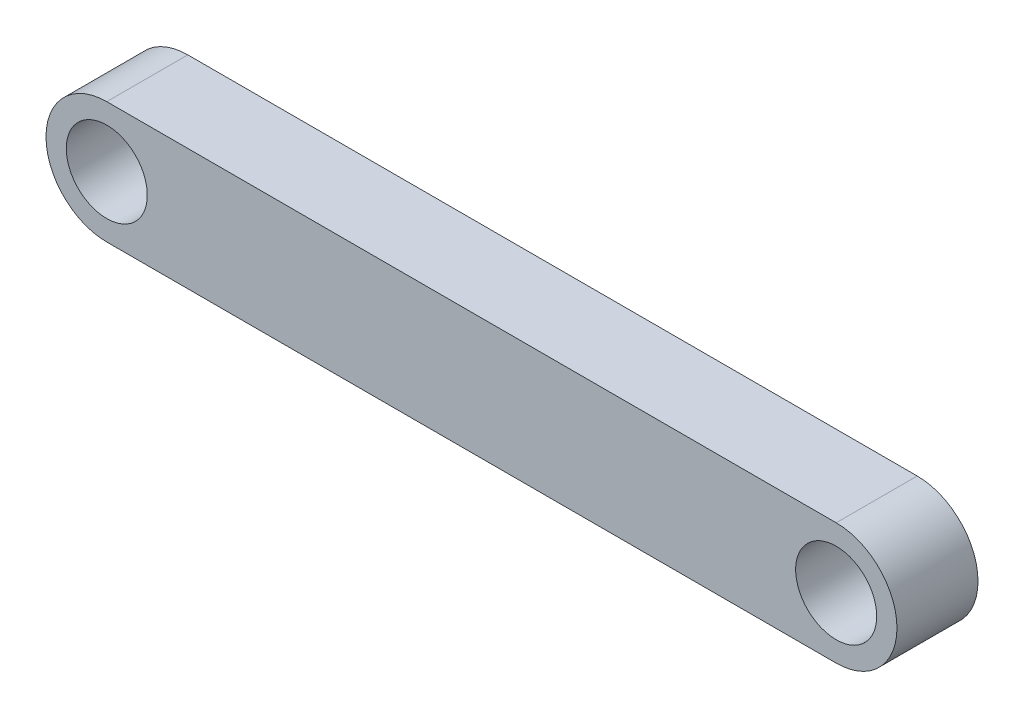
ISO-10303-21;
HEADER;
FILE_DESCRIPTION(('STEP AP214'),'2;1');
FILE_NAME('part.step','',(''),(''),'','','');
FILE_SCHEMA(('AUTOMOTIVE_DESIGN { 1 0 10303 214 1 1 1 1 }'));
ENDSEC;
DATA;
#1=APPLICATION_CONTEXT('core data for automotive mechanical design processes');
#2=APPLICATION_PROTOCOL_DEFINITION('international standard','automotive_design',2000,#1);
#3=PRODUCT_CONTEXT('',#1,'mechanical');
#4=PRODUCT('Part','Part','',(#3));
#5=PRODUCT_RELATED_PRODUCT_CATEGORY('part','',(#4));
#6=PRODUCT_DEFINITION_FORMATION('','',#4);
#7=PRODUCT_DEFINITION_CONTEXT('part definition',#1,'design');
#8=PRODUCT_DEFINITION('design','',#6,#7);
#9=PRODUCT_DEFINITION_SHAPE('','',#8);
#10=(LENGTH_UNIT() NAMED_UNIT(*) SI_UNIT(.MILLI.,.METRE.));
#11=(NAMED_UNIT(*) PLANE_ANGLE_UNIT() SI_UNIT($,.RADIAN.));
#12=(NAMED_UNIT(*) SI_UNIT($,.STERADIAN.) SOLID_ANGLE_UNIT());
#13=UNCERTAINTY_MEASURE_WITH_UNIT(LENGTH_MEASURE(1.E-05),#10,'distance_accuracy_value','');
#14=(GEOMETRIC_REPRESENTATION_CONTEXT(3) GLOBAL_UNCERTAINTY_ASSIGNED_CONTEXT((#13)) GLOBAL_UNIT_ASSIGNED_CONTEXT((#10,
#11,#12)) REPRESENTATION_CONTEXT('',''));
#15=CARTESIAN_POINT('',(0.,0.,0.));
#16=DIRECTION('',(0.,0.,1.));
#17=DIRECTION('',(1.,0.,0.));
#18=AXIS2_PLACEMENT_3D('',#15,#16,#17);
#19=CARTESIAN_POINT('',(0.,0.,4.));
#20=DIRECTION('',(0.,0.,1.));
#21=DIRECTION('',(1.,0.,0.));
#22=AXIS2_PLACEMENT_3D('',#19,#20,#21);
#23=PLANE('',#22);
#24=CARTESIAN_POINT('',(0.,0.,4.));
#25=DIRECTION('',(0.,0.,1.));
#26=DIRECTION('',(1.,0.,0.));
#27=AXIS2_PLACEMENT_3D('',#24,#25,#26);
#28=CIRCLE('',#27,2.);
#29=CARTESIAN_POINT('',(2.,0.,4.));
#30=VERTEX_POINT('',#29);
#31=EDGE_CURVE('E106',#30,#30,#28,.T.);
#32=ORIENTED_EDGE('',*,*,#31,.F.);
#33=EDGE_LOOP('',(#32));
#34=FACE_BOUND('',#33,.T.);
#35=CARTESIAN_POINT('',(0.,0.,4.));
#36=DIRECTION('',(0.,0.,1.));
#37=DIRECTION('',(1.,0.,0.));
#38=AXIS2_PLACEMENT_3D('',#35,#36,#37);
#39=CIRCLE('',#38,3.);
#40=CARTESIAN_POINT('',(0.,-3.,4.));
#41=VERTEX_POINT('',#40);
#42=CARTESIAN_POINT('',(0.,3.,4.));
#43=VERTEX_POINT('',#42);
#44=EDGE_CURVE('E91',#41,#43,#39,.T.);
#45=ORIENTED_EDGE('',*,*,#44,.T.);
#46=DIRECTION('',(-1.,0.,0.));
#47=VECTOR('',#46,1.);
#48=CARTESIAN_POINT('',(-36.,3.,4.));
#49=LINE('',#48,#47);
#50=CARTESIAN_POINT('',(-36.,3.,4.));
#51=VERTEX_POINT('',#50);
#52=EDGE_CURVE('E86',#43,#51,#49,.T.);
#53=ORIENTED_EDGE('',*,*,#52,.T.);
#54=CARTESIAN_POINT('',(-36.,0.,4.));
#55=DIRECTION('',(0.,0.,1.));
#56=DIRECTION('',(-1.,0.,0.));
#57=AXIS2_PLACEMENT_3D('',#54,#55,#56);
#58=CIRCLE('',#57,3.);
#59=CARTESIAN_POINT('',(-36.,-3.,4.));
#60=VERTEX_POINT('',#59);
#61=EDGE_CURVE('E87',#51,#60,#58,.T.);
#62=ORIENTED_EDGE('',*,*,#61,.T.);
#63=DIRECTION('',(1.,0.,0.));
#64=VECTOR('',#63,1.);
#65=CARTESIAN_POINT('',(-36.,-3.,4.));
#66=LINE('',#65,#64);
#67=EDGE_CURVE('E57',#60,#41,#66,.T.);
#68=ORIENTED_EDGE('',*,*,#67,.T.);
#69=EDGE_LOOP('',(#45,#53,#62,#68));
#70=FACE_BOUND('',#69,.T.);
#71=CARTESIAN_POINT('',(-36.,0.,4.));
#72=DIRECTION('',(0.,0.,1.));
#73=DIRECTION('',(-1.,0.,0.));
#74=AXIS2_PLACEMENT_3D('',#71,#72,#73);
#75=CIRCLE('',#74,2.);
#76=CARTESIAN_POINT('',(-38.,0.,4.));
#77=VERTEX_POINT('',#76);
#78=EDGE_CURVE('E123',#77,#77,#75,.T.);
#79=ORIENTED_EDGE('',*,*,#78,.F.);
#80=EDGE_LOOP('',(#79));
#81=FACE_BOUND('',#80,.T.);
#82=ADVANCED_FACE('F39',(#34,#70,#81),#23,.T.);
#83=CARTESIAN_POINT('',(0.,0.,0.));
#84=DIRECTION('',(0.,0.,1.));
#85=DIRECTION('',(1.,0.,0.));
#86=AXIS2_PLACEMENT_3D('',#83,#84,#85);
#87=PLANE('',#86);
#88=CARTESIAN_POINT('',(0.,0.,0.));
#89=DIRECTION('',(0.,0.,1.));
#90=DIRECTION('',(1.,0.,0.));
#91=AXIS2_PLACEMENT_3D('',#88,#89,#90);
#92=CIRCLE('',#91,3.);
#93=CARTESIAN_POINT('',(0.,-3.,0.));
#94=VERTEX_POINT('',#93);
#95=CARTESIAN_POINT('',(0.,3.,0.));
#96=VERTEX_POINT('',#95);
#97=EDGE_CURVE('E104',#94,#96,#92,.T.);
#98=ORIENTED_EDGE('',*,*,#97,.F.);
#99=DIRECTION('',(1.,0.,0.));
#100=VECTOR('',#99,1.);
#101=CARTESIAN_POINT('',(-36.,-3.,0.));
#102=LINE('',#101,#100);
#103=CARTESIAN_POINT('',(-36.,-3.,0.));
#104=VERTEX_POINT('',#103);
#105=EDGE_CURVE('E80',#104,#94,#102,.T.);
#106=ORIENTED_EDGE('',*,*,#105,.F.);
#107=CARTESIAN_POINT('',(-36.,0.,0.));
#108=DIRECTION('',(0.,0.,1.));
#109=DIRECTION('',(-1.,0.,0.));
#110=AXIS2_PLACEMENT_3D('',#107,#108,#109);
#111=CIRCLE('',#110,3.);
#112=CARTESIAN_POINT('',(-36.,3.,0.));
#113=VERTEX_POINT('',#112);
#114=EDGE_CURVE('E74',#113,#104,#111,.T.);
#115=ORIENTED_EDGE('',*,*,#114,.F.);
#116=DIRECTION('',(-1.,0.,0.));
#117=VECTOR('',#116,1.);
#118=CARTESIAN_POINT('',(-36.,3.,0.));
#119=LINE('',#118,#117);
#120=EDGE_CURVE('E94',#96,#113,#119,.T.);
#121=ORIENTED_EDGE('',*,*,#120,.F.);
#122=EDGE_LOOP('',(#98,#106,#115,#121));
#123=FACE_BOUND('',#122,.T.);
#124=CARTESIAN_POINT('',(0.,0.,0.));
#125=DIRECTION('',(0.,0.,1.));
#126=DIRECTION('',(1.,0.,0.));
#127=AXIS2_PLACEMENT_3D('',#124,#125,#126);
#128=CIRCLE('',#127,2.);
#129=CARTESIAN_POINT('',(2.,0.,0.));
#130=VERTEX_POINT('',#129);
#131=EDGE_CURVE('E119',#130,#130,#128,.T.);
#132=ORIENTED_EDGE('',*,*,#131,.T.);
#133=EDGE_LOOP('',(#132));
#134=FACE_BOUND('',#133,.T.);
#135=CARTESIAN_POINT('',(-36.,0.,0.));
#136=DIRECTION('',(0.,0.,1.));
#137=DIRECTION('',(-1.,0.,0.));
#138=AXIS2_PLACEMENT_3D('',#135,#136,#137);
#139=CIRCLE('',#138,2.);
#140=CARTESIAN_POINT('',(-38.,0.,0.));
#141=VERTEX_POINT('',#140);
#142=EDGE_CURVE('E125',#141,#141,#139,.T.);
#143=ORIENTED_EDGE('',*,*,#142,.T.);
#144=EDGE_LOOP('',(#143));
#145=FACE_BOUND('',#144,.T.);
#146=ADVANCED_FACE('F114',(#123,#134,#145),#87,.F.);
#147=CARTESIAN_POINT('',(0.,0.,4.));
#148=DIRECTION('',(0.,0.,-1.));
#149=DIRECTION('',(-1.,0.,0.));
#150=AXIS2_PLACEMENT_3D('',#147,#148,#149);
#151=CYLINDRICAL_SURFACE('',#150,3.);
#152=ORIENTED_EDGE('',*,*,#97,.T.);
#153=DIRECTION('',(0.,0.,-1.));
#154=VECTOR('',#153,1.);
#155=CARTESIAN_POINT('',(0.,3.,4.));
#156=LINE('',#155,#154);
#157=EDGE_CURVE('E11',#43,#96,#156,.T.);
#158=ORIENTED_EDGE('',*,*,#157,.F.);
#159=ORIENTED_EDGE('',*,*,#44,.F.);
#160=DIRECTION('',(0.,0.,-1.));
#161=VECTOR('',#160,1.);
#162=CARTESIAN_POINT('',(0.,-3.,4.));
#163=LINE('',#162,#161);
#164=EDGE_CURVE('E98',#41,#94,#163,.T.);
#165=ORIENTED_EDGE('',*,*,#164,.T.);
#166=EDGE_LOOP('',(#152,#158,#159,#165));
#167=FACE_BOUND('',#166,.T.);
#168=ADVANCED_FACE('F41',(#167),#151,.T.);
#169=CARTESIAN_POINT('',(-36.,3.,4.));
#170=DIRECTION('',(0.,-1.,0.));
#171=DIRECTION('',(0.,0.,-1.));
#172=AXIS2_PLACEMENT_3D('',#169,#170,#171);
#173=PLANE('',#172);
#174=ORIENTED_EDGE('',*,*,#120,.T.);
#175=DIRECTION('',(0.,0.,-1.));
#176=VECTOR('',#175,1.);
#177=CARTESIAN_POINT('',(-36.,3.,4.));
#178=LINE('',#177,#176);
#179=EDGE_CURVE('E48',#51,#113,#178,.T.);
#180=ORIENTED_EDGE('',*,*,#179,.F.);
#181=ORIENTED_EDGE('',*,*,#52,.F.);
#182=ORIENTED_EDGE('',*,*,#157,.T.);
#183=EDGE_LOOP('',(#174,#180,#181,#182));
#184=FACE_BOUND('',#183,.T.);
#185=ADVANCED_FACE('F92',(#184),#173,.F.);
#186=CARTESIAN_POINT('',(-36.,0.,4.));
#187=DIRECTION('',(0.,0.,-1.));
#188=DIRECTION('',(-1.,0.,0.));
#189=AXIS2_PLACEMENT_3D('',#186,#187,#188);
#190=CYLINDRICAL_SURFACE('',#189,3.);
#191=ORIENTED_EDGE('',*,*,#114,.T.);
#192=DIRECTION('',(0.,0.,-1.));
#193=VECTOR('',#192,1.);
#194=CARTESIAN_POINT('',(-36.,-3.,4.));
#195=LINE('',#194,#193);
#196=EDGE_CURVE('E96',#60,#104,#195,.T.);
#197=ORIENTED_EDGE('',*,*,#196,.F.);
#198=ORIENTED_EDGE('',*,*,#61,.F.);
#199=ORIENTED_EDGE('',*,*,#179,.T.);
#200=EDGE_LOOP('',(#191,#197,#198,#199));
#201=FACE_BOUND('',#200,.T.);
#202=ADVANCED_FACE('F100',(#201),#190,.T.);
#203=CARTESIAN_POINT('',(-36.,-3.,4.));
#204=DIRECTION('',(0.,1.,0.));
#205=DIRECTION('',(0.,0.,1.));
#206=AXIS2_PLACEMENT_3D('',#203,#204,#205);
#207=PLANE('',#206);
#208=ORIENTED_EDGE('',*,*,#105,.T.);
#209=ORIENTED_EDGE('',*,*,#164,.F.);
#210=ORIENTED_EDGE('',*,*,#67,.F.);
#211=ORIENTED_EDGE('',*,*,#196,.T.);
#212=EDGE_LOOP('',(#208,#209,#210,#211));
#213=FACE_BOUND('',#212,.T.);
#214=ADVANCED_FACE('F112',(#213),#207,.F.);
#215=CARTESIAN_POINT('',(0.,0.,4.));
#216=DIRECTION('',(0.,0.,-1.));
#217=DIRECTION('',(-1.,0.,0.));
#218=AXIS2_PLACEMENT_3D('',#215,#216,#217);
#219=CYLINDRICAL_SURFACE('',#218,2.);
#220=ORIENTED_EDGE('',*,*,#31,.T.);
#221=EDGE_LOOP('',(#220));
#222=FACE_BOUND('',#221,.T.);
#223=ORIENTED_EDGE('',*,*,#131,.F.);
#224=EDGE_LOOP('',(#223));
#225=FACE_BOUND('',#224,.T.);
#226=ADVANCED_FACE('F141',(#222,#225),#219,.F.);
#227=CARTESIAN_POINT('',(-36.,0.,4.));
#228=DIRECTION('',(0.,0.,-1.));
#229=DIRECTION('',(-1.,0.,0.));
#230=AXIS2_PLACEMENT_3D('',#227,#228,#229);
#231=CYLINDRICAL_SURFACE('',#230,2.);
#232=ORIENTED_EDGE('',*,*,#78,.T.);
#233=EDGE_LOOP('',(#232));
#234=FACE_BOUND('',#233,.T.);
#235=ORIENTED_EDGE('',*,*,#142,.F.);
#236=EDGE_LOOP('',(#235));
#237=FACE_BOUND('',#236,.T.);
#238=ADVANCED_FACE('F127',(#234,#237),#231,.F.);
#239=CLOSED_SHELL('',(#82,#146,#168,#185,#202,#214,#226,#238));
#240=MANIFOLD_SOLID_BREP('B2',#239);
#241=ADVANCED_BREP_SHAPE_REPRESENTATION('',(#18,#240),#14);
#242=SHAPE_DEFINITION_REPRESENTATION(#9,#241);
ENDSEC;
END-ISO-10303-21;
